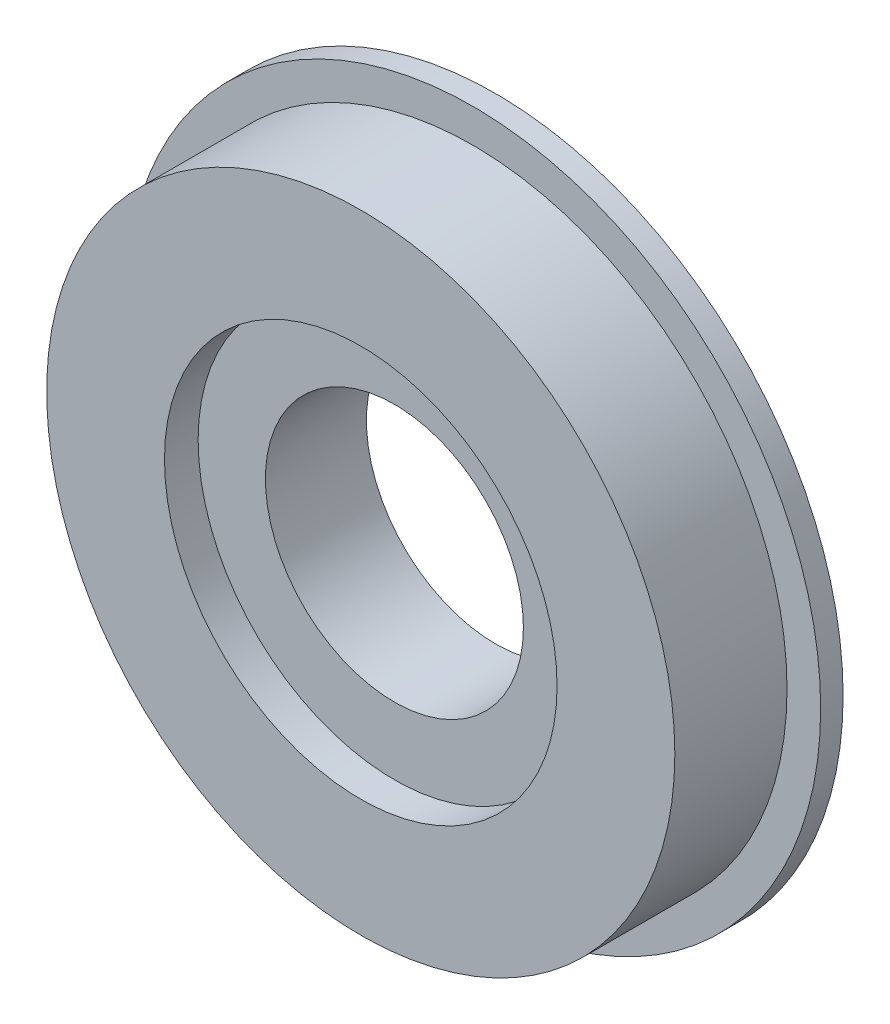
ISO-10303-21;
HEADER;
FILE_DESCRIPTION(('STEP AP214'),'2;1');
FILE_NAME('part.step','',(''),(''),'','','');
FILE_SCHEMA(('AUTOMOTIVE_DESIGN { 1 0 10303 214 1 1 1 1 }'));
ENDSEC;
DATA;
#1=APPLICATION_CONTEXT('core data for automotive mechanical design processes');
#2=APPLICATION_PROTOCOL_DEFINITION('international standard','automotive_design',2000,#1);
#3=PRODUCT_CONTEXT('',#1,'mechanical');
#4=PRODUCT('Part','Part','',(#3));
#5=PRODUCT_RELATED_PRODUCT_CATEGORY('part','',(#4));
#6=PRODUCT_DEFINITION_FORMATION('','',#4);
#7=PRODUCT_DEFINITION_CONTEXT('part definition',#1,'design');
#8=PRODUCT_DEFINITION('design','',#6,#7);
#9=PRODUCT_DEFINITION_SHAPE('','',#8);
#10=(LENGTH_UNIT() NAMED_UNIT(*) SI_UNIT(.MILLI.,.METRE.));
#11=(NAMED_UNIT(*) PLANE_ANGLE_UNIT() SI_UNIT($,.RADIAN.));
#12=(NAMED_UNIT(*) SI_UNIT($,.STERADIAN.) SOLID_ANGLE_UNIT());
#13=UNCERTAINTY_MEASURE_WITH_UNIT(LENGTH_MEASURE(1.E-05),#10,'distance_accuracy_value','');
#14=(GEOMETRIC_REPRESENTATION_CONTEXT(3) GLOBAL_UNCERTAINTY_ASSIGNED_CONTEXT((#13)) GLOBAL_UNIT_ASSIGNED_CONTEXT((#10,
#11,#12)) REPRESENTATION_CONTEXT('',''));
#15=CARTESIAN_POINT('',(0.,0.,0.));
#16=DIRECTION('',(0.,0.,1.));
#17=DIRECTION('',(1.,0.,0.));
#18=AXIS2_PLACEMENT_3D('',#15,#16,#17);
#19=CARTESIAN_POINT('',(0.,0.,-8.));
#20=DIRECTION('',(0.,0.,1.));
#21=DIRECTION('',(1.,0.,0.));
#22=AXIS2_PLACEMENT_3D('',#19,#20,#21);
#23=CYLINDRICAL_SURFACE('',#22,11.5);
#24=CARTESIAN_POINT('',(0.,0.,0.));
#25=DIRECTION('',(0.,0.,1.));
#26=DIRECTION('',(1.,0.,0.));
#27=AXIS2_PLACEMENT_3D('',#24,#25,#26);
#28=CIRCLE('',#27,11.5);
#29=CARTESIAN_POINT('',(11.5,0.,0.));
#30=VERTEX_POINT('',#29);
#31=EDGE_CURVE('E49',#30,#30,#28,.T.);
#32=ORIENTED_EDGE('',*,*,#31,.F.);
#33=EDGE_LOOP('',(#32));
#34=FACE_BOUND('',#33,.T.);
#35=CARTESIAN_POINT('',(0.,0.,9.));
#36=DIRECTION('',(0.,0.,1.));
#37=DIRECTION('',(1.,0.,0.));
#38=AXIS2_PLACEMENT_3D('',#35,#36,#37);
#39=CIRCLE('',#38,11.5);
#40=CARTESIAN_POINT('',(11.5,0.,9.));
#41=VERTEX_POINT('',#40);
#42=EDGE_CURVE('E35',#41,#41,#39,.F.);
#43=ORIENTED_EDGE('',*,*,#42,.F.);
#44=EDGE_LOOP('',(#43));
#45=FACE_BOUND('',#44,.T.);
#46=ADVANCED_FACE('F31',(#34,#45),#23,.F.);
#47=CARTESIAN_POINT('',(0.,0.,2.));
#48=DIRECTION('',(0.,0.,1.));
#49=DIRECTION('',(1.,0.,0.));
#50=AXIS2_PLACEMENT_3D('',#47,#48,#49);
#51=PLANE('',#50);
#52=CARTESIAN_POINT('',(0.,0.,2.));
#53=DIRECTION('',(0.,0.,1.));
#54=DIRECTION('',(1.,0.,0.));
#55=AXIS2_PLACEMENT_3D('',#52,#53,#54);
#56=CIRCLE('',#55,31.);
#57=CARTESIAN_POINT('',(31.,0.,2.));
#58=VERTEX_POINT('',#57);
#59=EDGE_CURVE('E10',#58,#58,#56,.T.);
#60=ORIENTED_EDGE('',*,*,#59,.T.);
#61=EDGE_LOOP('',(#60));
#62=FACE_BOUND('',#61,.T.);
#63=CARTESIAN_POINT('',(0.,0.,2.));
#64=DIRECTION('',(0.,0.,1.));
#65=DIRECTION('',(1.,0.,0.));
#66=AXIS2_PLACEMENT_3D('',#63,#64,#65);
#67=CIRCLE('',#66,28.);
#68=CARTESIAN_POINT('',(28.,0.,2.));
#69=VERTEX_POINT('',#68);
#70=EDGE_CURVE('E46',#69,#69,#67,.T.);
#71=ORIENTED_EDGE('',*,*,#70,.F.);
#72=EDGE_LOOP('',(#71));
#73=FACE_BOUND('',#72,.T.);
#74=ADVANCED_FACE('F67',(#62,#73),#51,.T.);
#75=CARTESIAN_POINT('',(0.,0.,2.));
#76=DIRECTION('',(0.,0.,-1.));
#77=DIRECTION('',(-1.,0.,0.));
#78=AXIS2_PLACEMENT_3D('',#75,#76,#77);
#79=CYLINDRICAL_SURFACE('',#78,31.);
#80=ORIENTED_EDGE('',*,*,#59,.F.);
#81=EDGE_LOOP('',(#80));
#82=FACE_BOUND('',#81,.T.);
#83=CARTESIAN_POINT('',(0.,0.,0.));
#84=DIRECTION('',(0.,0.,1.));
#85=DIRECTION('',(1.,0.,0.));
#86=AXIS2_PLACEMENT_3D('',#83,#84,#85);
#87=CIRCLE('',#86,31.);
#88=CARTESIAN_POINT('',(31.,0.,0.));
#89=VERTEX_POINT('',#88);
#90=EDGE_CURVE('E39',#89,#89,#87,.T.);
#91=ORIENTED_EDGE('',*,*,#90,.T.);
#92=EDGE_LOOP('',(#91));
#93=FACE_BOUND('',#92,.T.);
#94=ADVANCED_FACE('F33',(#82,#93),#79,.T.);
#95=CARTESIAN_POINT('',(0.,0.,0.));
#96=DIRECTION('',(0.,0.,1.));
#97=DIRECTION('',(1.,0.,0.));
#98=AXIS2_PLACEMENT_3D('',#95,#96,#97);
#99=PLANE('',#98);
#100=ORIENTED_EDGE('',*,*,#31,.T.);
#101=EDGE_LOOP('',(#100));
#102=FACE_BOUND('',#101,.T.);
#103=ORIENTED_EDGE('',*,*,#90,.F.);
#104=EDGE_LOOP('',(#103));
#105=FACE_BOUND('',#104,.T.);
#106=ADVANCED_FACE('F87',(#102,#105),#99,.F.);
#107=CARTESIAN_POINT('',(0.,0.,12.));
#108=DIRECTION('',(0.,0.,-1.));
#109=DIRECTION('',(-1.,0.,0.));
#110=AXIS2_PLACEMENT_3D('',#107,#108,#109);
#111=CYLINDRICAL_SURFACE('',#110,28.);
#112=CARTESIAN_POINT('',(0.,0.,12.));
#113=DIRECTION('',(0.,0.,1.));
#114=DIRECTION('',(1.,0.,0.));
#115=AXIS2_PLACEMENT_3D('',#112,#113,#114);
#116=CIRCLE('',#115,28.);
#117=CARTESIAN_POINT('',(28.,0.,12.));
#118=VERTEX_POINT('',#117);
#119=EDGE_CURVE('E44',#118,#118,#116,.T.);
#120=ORIENTED_EDGE('',*,*,#119,.F.);
#121=EDGE_LOOP('',(#120));
#122=FACE_BOUND('',#121,.T.);
#123=ORIENTED_EDGE('',*,*,#70,.T.);
#124=EDGE_LOOP('',(#123));
#125=FACE_BOUND('',#124,.T.);
#126=ADVANCED_FACE('F84',(#122,#125),#111,.T.);
#127=CARTESIAN_POINT('',(0.,0.,12.));
#128=DIRECTION('',(0.,0.,1.));
#129=DIRECTION('',(1.,0.,0.));
#130=AXIS2_PLACEMENT_3D('',#127,#128,#129);
#131=PLANE('',#130);
#132=CARTESIAN_POINT('',(0.,0.,12.));
#133=DIRECTION('',(0.,0.,1.));
#134=DIRECTION('',(1.,0.,0.));
#135=AXIS2_PLACEMENT_3D('',#132,#133,#134);
#136=CIRCLE('',#135,17.5);
#137=CARTESIAN_POINT('',(17.5,0.,12.));
#138=VERTEX_POINT('',#137);
#139=EDGE_CURVE('E54',#138,#138,#136,.T.);
#140=ORIENTED_EDGE('',*,*,#139,.F.);
#141=EDGE_LOOP('',(#140));
#142=FACE_BOUND('',#141,.T.);
#143=ORIENTED_EDGE('',*,*,#119,.T.);
#144=EDGE_LOOP('',(#143));
#145=FACE_BOUND('',#144,.T.);
#146=ADVANCED_FACE('F81',(#142,#145),#131,.T.);
#147=CARTESIAN_POINT('',(0.,0.,9.));
#148=DIRECTION('',(0.,0.,1.));
#149=DIRECTION('',(1.,0.,0.));
#150=AXIS2_PLACEMENT_3D('',#147,#148,#149);
#151=PLANE('',#150);
#152=CARTESIAN_POINT('',(0.,0.,9.));
#153=DIRECTION('',(0.,0.,1.));
#154=DIRECTION('',(1.,0.,0.));
#155=AXIS2_PLACEMENT_3D('',#152,#153,#154);
#156=CIRCLE('',#155,17.5);
#157=CARTESIAN_POINT('',(17.5,0.,9.));
#158=VERTEX_POINT('',#157);
#159=EDGE_CURVE('E57',#158,#158,#156,.T.);
#160=ORIENTED_EDGE('',*,*,#159,.T.);
#161=EDGE_LOOP('',(#160));
#162=FACE_BOUND('',#161,.T.);
#163=ORIENTED_EDGE('',*,*,#42,.T.);
#164=EDGE_LOOP('',(#163));
#165=FACE_BOUND('',#164,.T.);
#166=ADVANCED_FACE('F64',(#162,#165),#151,.T.);
#167=CARTESIAN_POINT('',(0.,0.,9.));
#168=DIRECTION('',(0.,0.,1.));
#169=DIRECTION('',(1.,0.,0.));
#170=AXIS2_PLACEMENT_3D('',#167,#168,#169);
#171=CYLINDRICAL_SURFACE('',#170,17.5);
#172=ORIENTED_EDGE('',*,*,#159,.F.);
#173=EDGE_LOOP('',(#172));
#174=FACE_BOUND('',#173,.T.);
#175=ORIENTED_EDGE('',*,*,#139,.T.);
#176=EDGE_LOOP('',(#175));
#177=FACE_BOUND('',#176,.T.);
#178=ADVANCED_FACE('F79',(#174,#177),#171,.F.);
#179=CLOSED_SHELL('',(#46,#74,#94,#106,#126,#146,#166,#178));
#180=MANIFOLD_SOLID_BREP('B2',#179);
#181=ADVANCED_BREP_SHAPE_REPRESENTATION('',(#18,#180),#14);
#182=SHAPE_DEFINITION_REPRESENTATION(#9,#181);
ENDSEC;
END-ISO-10303-21;
